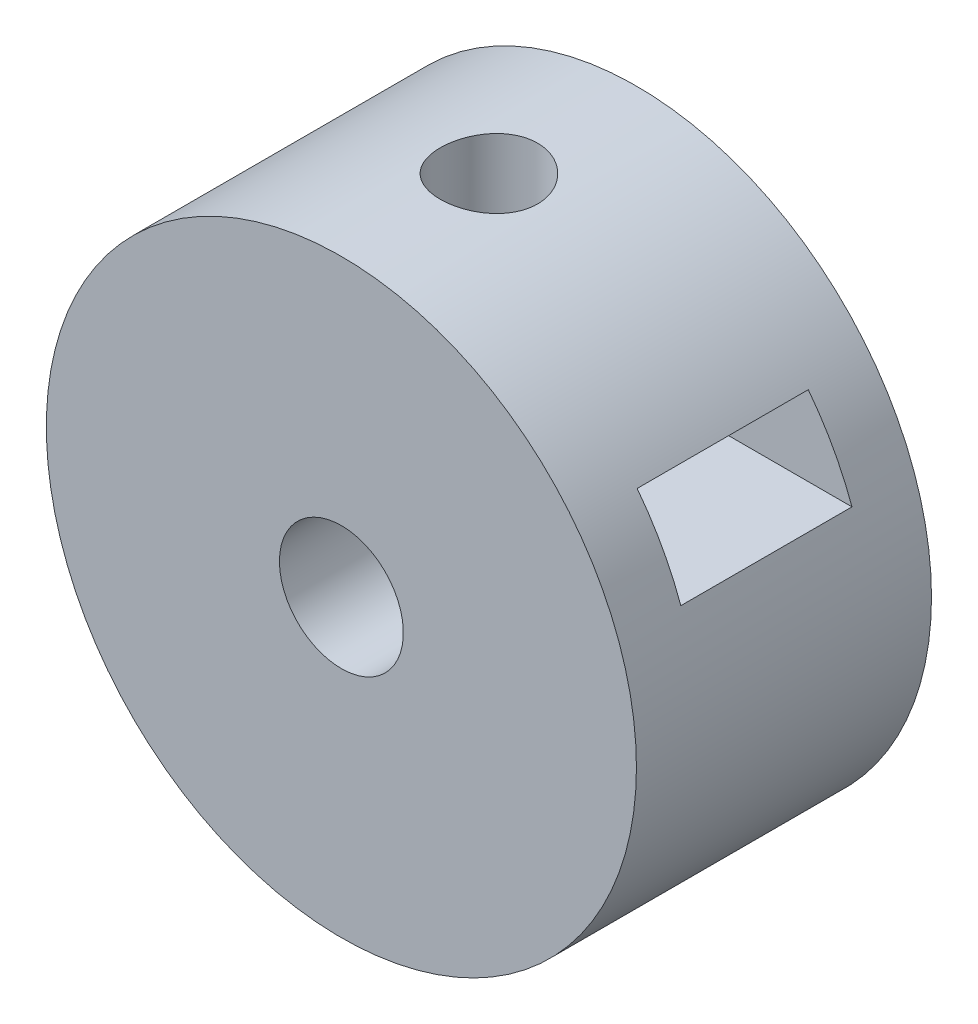
ISO-10303-21;
HEADER;
FILE_DESCRIPTION(('STEP AP214'),'2;1');
FILE_NAME('part.step','',(''),(''),'','','');
FILE_SCHEMA(('AUTOMOTIVE_DESIGN { 1 0 10303 214 1 1 1 1 }'));
ENDSEC;
DATA;
#1=APPLICATION_CONTEXT('core data for automotive mechanical design processes');
#2=APPLICATION_PROTOCOL_DEFINITION('international standard','automotive_design',2000,#1);
#3=PRODUCT_CONTEXT('',#1,'mechanical');
#4=PRODUCT('Part','Part','',(#3));
#5=PRODUCT_RELATED_PRODUCT_CATEGORY('part','',(#4));
#6=PRODUCT_DEFINITION_FORMATION('','',#4);
#7=PRODUCT_DEFINITION_CONTEXT('part definition',#1,'design');
#8=PRODUCT_DEFINITION('design','',#6,#7);
#9=PRODUCT_DEFINITION_SHAPE('','',#8);
#10=(LENGTH_UNIT() NAMED_UNIT(*) SI_UNIT(.MILLI.,.METRE.));
#11=(NAMED_UNIT(*) PLANE_ANGLE_UNIT() SI_UNIT($,.RADIAN.));
#12=(NAMED_UNIT(*) SI_UNIT($,.STERADIAN.) SOLID_ANGLE_UNIT());
#13=UNCERTAINTY_MEASURE_WITH_UNIT(LENGTH_MEASURE(1.E-05),#10,'distance_accuracy_value','');
#14=(GEOMETRIC_REPRESENTATION_CONTEXT(3) GLOBAL_UNCERTAINTY_ASSIGNED_CONTEXT((#13)) GLOBAL_UNIT_ASSIGNED_CONTEXT((#10,
#11,#12)) REPRESENTATION_CONTEXT('',''));
#15=CARTESIAN_POINT('',(0.,0.,0.));
#16=DIRECTION('',(0.,0.,1.));
#17=DIRECTION('',(1.,0.,0.));
#18=AXIS2_PLACEMENT_3D('',#15,#16,#17);
#19=CARTESIAN_POINT('',(0.,0.,5.));
#20=DIRECTION('',(0.,1.,0.));
#21=DIRECTION('',(0.,0.,1.));
#22=AXIS2_PLACEMENT_3D('',#19,#20,#21);
#23=CYLINDRICAL_SURFACE('',#22,1.65);
#24=CARTESIAN_POINT('',(0.,2.1,6.65));
#25=CARTESIAN_POINT('',(0.0796001917218926,2.0999938180354,6.64999361450812));
#26=CARTESIAN_POINT('',(0.159308770499119,2.09542768834569,6.64419275245601));
#27=CARTESIAN_POINT('',(0.316170572494338,2.07757117536402,6.6213729727077));
#28=CARTESIAN_POINT('',(0.393318112451337,2.06426259522657,6.60433065634434));
#29=CARTESIAN_POINT('',(0.542368135039011,2.03018382077281,6.56023747522717));
#30=CARTESIAN_POINT('',(0.614300091198769,2.00946025733616,6.53324912734498));
#31=CARTESIAN_POINT('',(0.752077362908829,1.96206497287833,6.47058386629792));
#32=CARTESIAN_POINT('',(0.817922465170863,1.93539304353326,6.43490664882713));
#33=CARTESIAN_POINT('',(0.964068401518123,1.86790135842462,6.34270711178072));
#34=CARTESIAN_POINT('',(1.04169930716527,1.82535110257821,6.28321874515638));
#35=CARTESIAN_POINT('',(1.18434758790923,1.73620969792247,6.15290838636037));
#36=CARTESIAN_POINT('',(1.24932779180486,1.68960720606361,6.08205407821168));
#37=CARTESIAN_POINT('',(1.36703855627689,1.59591069409266,5.92907238506917));
#38=CARTESIAN_POINT('',(1.41957731068858,1.54881937694977,5.84679609581782));
#39=CARTESIAN_POINT('',(1.51022360695896,1.46054381250586,5.67184371125375));
#40=CARTESIAN_POINT('',(1.54838104572859,1.41933945492904,5.57920504754939));
#41=CARTESIAN_POINT('',(1.59570742473321,1.36544561064423,5.42404025658079));
#42=CARTESIAN_POINT('',(1.61034132688087,1.34800506607107,5.36485700150996));
#43=CARTESIAN_POINT('',(1.63306902060523,1.32038195634849,5.24365707695354));
#44=CARTESIAN_POINT('',(1.64117835945663,1.31018214424956,5.18164751738944));
#45=CARTESIAN_POINT('',(1.65027043260621,1.29871896426366,5.05576546949217));
#46=CARTESIAN_POINT('',(1.65119930381098,1.29752314003772,4.99188250271423));
#47=CARTESIAN_POINT('',(1.6456926992374,1.30449590455939,4.86492832008789));
#48=CARTESIAN_POINT('',(1.63924962574396,1.31267415448361,4.80185800958314));
#49=CARTESIAN_POINT('',(1.61780178892174,1.33904613745083,4.66734621233217));
#50=CARTESIAN_POINT('',(1.6014694495673,1.35877227515616,4.59643047797041));
#51=CARTESIAN_POINT('',(1.56060761164531,1.40551219547294,4.45949918513617));
#52=CARTESIAN_POINT('',(1.53605491655817,1.43254655867279,4.39349814675986));
#53=CARTESIAN_POINT('',(1.46707205028577,1.50369994423796,4.23821719285571));
#54=CARTESIAN_POINT('',(1.41866360318922,1.55005033443668,4.1517381921342));
#55=CARTESIAN_POINT('',(1.30792828658772,1.64458528727684,3.98931138692952));
#56=CARTESIAN_POINT('',(1.24558322317743,1.69277217858693,3.913377560922));
#57=CARTESIAN_POINT('',(1.10598968758156,1.78718584128934,3.77143168100951));
#58=CARTESIAN_POINT('',(1.02847507323562,1.83335630332353,3.70564118311849));
#59=CARTESIAN_POINT('',(0.859952779591852,1.91815545967621,3.58809930131745));
#60=CARTESIAN_POINT('',(0.768983754166365,1.95680504781948,3.53630886305187));
#61=CARTESIAN_POINT('',(0.603780342156997,2.0126289826309,3.46261110957425));
#62=CARTESIAN_POINT('',(0.532466411604595,2.03277708869725,3.43639438391158));
#63=CARTESIAN_POINT('',(0.385324591087862,2.06571772060382,3.39380125336377));
#64=CARTESIAN_POINT('',(0.309500190789609,2.07851585335736,3.3774173471002));
#65=CARTESIAN_POINT('',(0.154999735900778,2.09571939451449,3.35543712386776));
#66=CARTESIAN_POINT('',(0.0763126631089624,2.10008786488932,3.34988828393385));
#67=CARTESIAN_POINT('',(-0.0810368611742931,2.09990947822907,3.35011509755749));
#68=CARTESIAN_POINT('',(-0.159699313603924,2.09536301708972,3.35589024823744));
#69=CARTESIAN_POINT('',(-0.309199419463994,2.07838350076403,3.37758859539958));
#70=CARTESIAN_POINT('',(-0.380206952578729,2.06650316581338,3.39280092243229));
#71=CARTESIAN_POINT('',(-0.518325557988668,2.03625679911049,3.43188187615466));
#72=CARTESIAN_POINT('',(-0.585435690987153,2.01788921138285,3.45575257960342));
#73=CARTESIAN_POINT('',(-0.719567651637166,1.97422723457336,3.51324168113832));
#74=CARTESIAN_POINT('',(-0.786188735403454,1.94850994336071,3.5474668113865));
#75=CARTESIAN_POINT('',(-0.912813832897116,1.8925042820974,3.62350680489809));
#76=CARTESIAN_POINT('',(-0.972814818947199,1.86221383540644,3.66532511793407));
#77=CARTESIAN_POINT('',(-1.09684245197889,1.79246481529262,3.76432121565521));
#78=CARTESIAN_POINT('',(-1.15938586791839,1.75236844571197,3.82290458959129));
#79=CARTESIAN_POINT('',(-1.27436601311465,1.67062027754788,3.94845191861328));
#80=CARTESIAN_POINT('',(-1.32678853788087,1.62896638942296,4.01542743777836));
#81=CARTESIAN_POINT('',(-1.41986675636619,1.54843631652797,4.15539526452938));
#82=CARTESIAN_POINT('',(-1.46080385505605,1.50951538790248,4.22817422184057));
#83=CARTESIAN_POINT('',(-1.53195600389831,1.43724358947683,4.38136235746067));
#84=CARTESIAN_POINT('',(-1.56219356778283,1.40388110299937,4.46175505745555));
#85=CARTESIAN_POINT('',(-1.6027454746411,1.35714834773738,4.60340485913962));
#86=CARTESIAN_POINT('',(-1.61633523761651,1.34079083862987,4.66271530905632));
#87=CARTESIAN_POINT('',(-1.63694597357536,1.31555276369334,4.78396613270172));
#88=CARTESIAN_POINT('',(-1.64398165953626,1.30665545527864,4.84590028795323));
#89=CARTESIAN_POINT('',(-1.65094807892772,1.29784797344929,4.97123889460129));
#90=CARTESIAN_POINT('',(-1.6508336173396,1.29799496763775,5.0346501654927));
#91=CARTESIAN_POINT('',(-1.64339764675994,1.30739182936648,5.1603893372944));
#92=CARTESIAN_POINT('',(-1.63606718526497,1.31665300437753,5.22271579458027));
#93=CARTESIAN_POINT('',(-1.61250400832135,1.34545038175293,5.3577735263882));
#94=CARTESIAN_POINT('',(-1.59468547500907,1.36677930482589,5.42983004432642));
#95=CARTESIAN_POINT('',(-1.55060852916343,1.41658657292558,5.5687318093002));
#96=CARTESIAN_POINT('',(-1.52432612117107,1.44508519349438,5.63556156058102));
#97=CARTESIAN_POINT('',(-1.45126639380762,1.51906368171455,5.7916016941077));
#98=CARTESIAN_POINT('',(-1.40054067680743,1.56655928090644,5.8780008846119));
#99=CARTESIAN_POINT('',(-1.28487186823615,1.6627687513611,6.03995622008662));
#100=CARTESIAN_POINT('',(-1.21991247055743,1.71148396264931,6.1154997631153));
#101=CARTESIAN_POINT('',(-1.07507073475416,1.806051241021,6.25579819648507));
#102=CARTESIAN_POINT('',(-0.99498707620665,1.85185200990308,6.32038216477662));
#103=CARTESIAN_POINT('',(-0.821210776278299,1.93515547328398,6.43487203880746));
#104=CARTESIAN_POINT('',(-0.727555859078121,1.97268046573947,6.48481750862035));
#105=CARTESIAN_POINT('',(-0.559761451594887,2.02529918212826,6.55391848950023));
#106=CARTESIAN_POINT('',(-0.488606159769221,2.04373969025009,6.57781893609655));
#107=CARTESIAN_POINT('',(-0.342344605279582,2.07323990795691,6.615849955775));
#108=CARTESIAN_POINT('',(-0.267248873170231,2.08431830666141,6.63000527072368));
#109=CARTESIAN_POINT('',(-0.159594987942083,2.09416999414735,6.64257467488049));
#110=CARTESIAN_POINT('',(-0.127787691220449,2.09635137850741,6.64535421655978));
#111=CARTESIAN_POINT('',(-0.063992797513904,2.09926779444843,6.6490683799553));
#112=CARTESIAN_POINT('',(-0.0320051598682212,2.10000248560664,6.65000256743965));
#113=CARTESIAN_POINT('',(0.,2.1,6.65));
#114=B_SPLINE_CURVE_WITH_KNOTS('',3,(#24,#25,#26,#27,#28,#29,#30,#31,#32,#33,#34,#35,#36,#37,
#38,#39,#40,#41,#42,#43,#44,#45,#46,#47,#48,#49,#50,#51,#52,#53,#54,#55,#56,#57,#58,#59,#60,#61,
#62,#63,#64,#65,#66,#67,#68,#69,#70,#71,#72,#73,#74,#75,#76,#77,#78,#79,#80,#81,#82,#83,#84,#85,
#86,#87,#88,#89,#90,#91,#92,#93,#94,#95,#96,#97,#98,#99,#100,#101,#102,#103,#104,#105,#106,#107,
#108,#109,#110,#111,#112,#113),.UNSPECIFIED.,.T.,.F.,(4,2,2,2,2,2,2,2,2,2,2,2,2,2,2,2,2,2,2,2,2,
2,2,2,2,2,2,2,2,2,2,2,2,2,2,2,2,2,2,2,2,2,2,2,4),(0.,0.238661472958411,0.477821285085834,
0.715502781694245,0.953192603699511,1.27148632735928,1.5907016186489,1.91455736970206,
2.2372789056034,2.42686912721923,2.61600622818342,2.80656074601866,2.99731183126047,
3.22225238489295,3.44783311078609,3.77436809280817,4.10133187377641,4.43465133130391,
4.76703113897674,5.00189559537822,5.23658064706573,5.47229175309842,5.70799239187121,
5.92779265636468,6.14764567605816,6.38434382448235,6.62114978109132,6.90396996247715,
7.18718423654335,7.46269090616848,7.73761436414506,7.92595962488161,8.11388105094998,
8.30299041984844,8.49233470265541,8.72274064709717,8.95380563966567,9.28474027874506,
9.61605603742465,9.95214020627244,10.2873074682569,10.5182801291943,10.7486641904491,
10.8446011683606,10.9405607185977),.UNSPECIFIED.);
#115=CARTESIAN_POINT('',(0.,2.1,6.65));
#116=VERTEX_POINT('',#115);
#117=EDGE_CURVE('E143',#116,#116,#114,.T.);
#118=ORIENTED_EDGE('',*,*,#117,.F.);
#119=EDGE_LOOP('',(#118));
#120=FACE_BOUND('',#119,.T.);
#121=CARTESIAN_POINT('',(0.,3.4,5.));
#122=DIRECTION('',(0.,1.,0.));
#123=DIRECTION('',(0.,0.,1.));
#124=AXIS2_PLACEMENT_3D('',#121,#122,#123);
#125=CIRCLE('',#124,1.65);
#126=CARTESIAN_POINT('',(0.,3.4,6.65));
#127=VERTEX_POINT('',#126);
#128=EDGE_CURVE('E134',#127,#127,#125,.T.);
#129=ORIENTED_EDGE('',*,*,#128,.T.);
#130=EDGE_LOOP('',(#129));
#131=FACE_BOUND('',#130,.T.);
#132=ADVANCED_FACE('F44',(#120,#131),#23,.F.);
#133=CARTESIAN_POINT('',(0.,0.,10.));
#134=DIRECTION('',(0.,0.,-1.));
#135=DIRECTION('',(-1.,0.,0.));
#136=AXIS2_PLACEMENT_3D('',#133,#134,#135);
#137=CYLINDRICAL_SURFACE('',#136,10.);
#138=CARTESIAN_POINT('',(0.,10.,6.65));
#139=CARTESIAN_POINT('',(-0.0920114531057516,9.99999843258099,6.64999629901469));
#140=CARTESIAN_POINT('',(-0.184073454347173,9.99871684765511,6.64227754131458));
#141=CARTESIAN_POINT('',(-0.36561632253533,9.99372775496381,6.61161876486207));
#142=CARTESIAN_POINT('',(-0.45509472135177,9.99001800272159,6.5886646630412));
#143=CARTESIAN_POINT('',(-0.628817487751616,9.98058875631552,6.52824636106409));
#144=CARTESIAN_POINT('',(-0.713066038744486,9.974870893487,6.4907939364397));
#145=CARTESIAN_POINT('',(-0.874072236504043,9.96205444853338,6.40247274585138));
#146=CARTESIAN_POINT('',(-0.95083075765333,9.95495602786423,6.35160554849499));
#147=CARTESIAN_POINT('',(-1.09540879372213,9.9400912001718,6.23739122286708));
#148=CARTESIAN_POINT('',(-1.16314787882339,9.93231968689365,6.17394293638175));
#149=CARTESIAN_POINT('',(-1.28706950777735,9.9170237472334,6.03658522640678));
#150=CARTESIAN_POINT('',(-1.34325132909589,9.90949933632427,5.96267514935682));
#151=CARTESIAN_POINT('',(-1.44278500045253,9.89550007731641,5.80594065632332));
#152=CARTESIAN_POINT('',(-1.48605749570899,9.88903182722124,5.72306520565612));
#153=CARTESIAN_POINT('',(-1.55803674048924,9.87794796970923,5.55109737476351));
#154=CARTESIAN_POINT('',(-1.58674445381556,9.87333223970889,5.46200540635072));
#155=CARTESIAN_POINT('',(-1.6285261950301,9.86652679242373,5.28098541799901));
#156=CARTESIAN_POINT('',(-1.64173895927951,9.86431555933323,5.18909024432124));
#157=CARTESIAN_POINT('',(-1.65258585530687,9.86250435770823,5.00436263407657));
#158=CARTESIAN_POINT('',(-1.6502210677036,9.86290420804218,4.91153026296937));
#159=CARTESIAN_POINT('',(-1.63009303176278,9.86625034802632,4.72855272294329));
#160=CARTESIAN_POINT('',(-1.61248549472488,9.86917088684506,4.63838988597263));
#161=CARTESIAN_POINT('',(-1.5626160736781,9.87718903199043,4.4623159294666));
#162=CARTESIAN_POINT('',(-1.53035369619838,9.88228671162733,4.37640495321172));
#163=CARTESIAN_POINT('',(-1.45193210975571,9.89411264039674,4.21080647007558));
#164=CARTESIAN_POINT('',(-1.4057081060585,9.90084846298694,4.13115021075931));
#165=CARTESIAN_POINT('',(-1.30072141548377,9.9151864393107,3.98066567609225));
#166=CARTESIAN_POINT('',(-1.24195773629987,9.92278866158316,3.90983810008771));
#167=CARTESIAN_POINT('',(-1.11271072676603,9.93811607123993,3.77812002111733));
#168=CARTESIAN_POINT('',(-1.04209376928223,9.94584163094155,3.71736060537004));
#169=CARTESIAN_POINT('',(-0.891597059898568,9.96045987838133,3.60853397839373));
#170=CARTESIAN_POINT('',(-0.811717250503359,9.9673525609492,3.56046684595291));
#171=CARTESIAN_POINT('',(-0.644840083170755,9.97953794169528,3.47837784946568));
#172=CARTESIAN_POINT('',(-0.557837003156561,9.98482933722619,3.44436741236198));
#173=CARTESIAN_POINT('',(-0.379246930002472,9.99320544362233,3.39147808722466));
#174=CARTESIAN_POINT('',(-0.287660313260822,9.99629033536768,3.37259795885521));
#175=CARTESIAN_POINT('',(-0.103632983819162,9.99988156603306,3.35068253883883));
#176=CARTESIAN_POINT('',(-0.0112142564118358,10.0004171933872,3.34746726387846));
#177=CARTESIAN_POINT('',(0.172841505554681,9.99892971175882,3.35649319868026));
#178=CARTESIAN_POINT('',(0.264478569441164,9.99690669920295,3.36873382596047));
#179=CARTESIAN_POINT('',(0.443814955541769,9.99054737820398,3.4081744027771));
#180=CARTESIAN_POINT('',(0.531534371938301,9.98622483070291,3.43528539430835));
#181=CARTESIAN_POINT('',(0.701182959294593,9.97574921956607,3.50360239255507));
#182=CARTESIAN_POINT('',(0.78311181018899,9.96959605484327,3.54480917766168));
#183=CARTESIAN_POINT('',(0.939636398877252,9.95606928426946,3.64056131949898));
#184=CARTESIAN_POINT('',(1.01416235726447,9.94868555427359,3.6952192859171));
#185=CARTESIAN_POINT('',(1.15304841333209,9.93354765732487,3.81616714906879));
#186=CARTESIAN_POINT('',(1.21740778758216,9.92579346406183,3.88245787285429));
#187=CARTESIAN_POINT('',(1.33479962911472,9.91069407401676,4.0255961063283));
#188=CARTESIAN_POINT('',(1.38771058951944,9.90335382329475,4.10254387109881));
#189=CARTESIAN_POINT('',(1.47985547415617,9.89000528724129,4.26434104706746));
#190=CARTESIAN_POINT('',(1.51908982562647,9.88399696030451,4.34919021133191));
#191=CARTESIAN_POINT('',(1.58258535747086,9.87402953570153,4.52403953240315));
#192=CARTESIAN_POINT('',(1.60690737863649,9.87006212213643,4.61401709979667));
#193=CARTESIAN_POINT('',(1.64007952798876,9.86460473721113,4.79685131178056));
#194=CARTESIAN_POINT('',(1.64893097191819,9.86311455516768,4.88970771084816));
#195=CARTESIAN_POINT('',(1.65087457438796,9.86278931217107,5.07445064130181));
#196=CARTESIAN_POINT('',(1.64415796786954,9.86392203182987,5.16633516019211));
#197=CARTESIAN_POINT('',(1.61556925478547,9.86864441177183,5.34764775186387));
#198=CARTESIAN_POINT('',(1.59369719454886,9.87223406454433,5.4370758321536));
#199=CARTESIAN_POINT('',(1.53549112071357,9.88145370519205,5.61086524243541));
#200=CARTESIAN_POINT('',(1.49917324977366,9.88708141498759,5.69523210745097));
#201=CARTESIAN_POINT('',(1.41312606218935,9.89974533231771,5.85670626686032));
#202=CARTESIAN_POINT('',(1.36339610211421,9.90678160742252,5.93381321272773));
#203=CARTESIAN_POINT('',(1.25125259966706,9.92157214136343,6.07954549763769));
#204=CARTESIAN_POINT('',(1.18869826623127,9.92933379899765,6.14806175981957));
#205=CARTESIAN_POINT('',(1.05297867490409,9.94464125601211,6.27369059987676));
#206=CARTESIAN_POINT('',(0.979810970092673,9.95218700513286,6.33080054078024));
#207=CARTESIAN_POINT('',(0.824354696103048,9.96627143049842,6.43234742257348));
#208=CARTESIAN_POINT('',(0.742007852048189,9.97280295936929,6.47669614797803));
#209=CARTESIAN_POINT('',(0.570959586923796,9.98405342047581,6.55086335280631));
#210=CARTESIAN_POINT('',(0.482264623543764,9.98877416450827,6.58069636412524));
#211=CARTESIAN_POINT('',(0.327682758240929,9.99483601455804,6.61847934152685));
#212=CARTESIAN_POINT('',(0.2627330667111,9.99676220083327,6.6302807488145));
#213=CARTESIAN_POINT('',(0.131864227625941,9.99934474465587,6.64604233893311));
#214=CARTESIAN_POINT('',(0.0659450962546689,10.0000011233775,6.65000265251579));
#215=CARTESIAN_POINT('',(0.,10.,6.65));
#216=B_SPLINE_CURVE_WITH_KNOTS('',3,(#138,#139,#140,#141,#142,#143,#144,#145,#146,#147,#148,
#149,#150,#151,#152,#153,#154,#155,#156,#157,#158,#159,#160,#161,#162,#163,#164,#165,#166,#167,
#168,#169,#170,#171,#172,#173,#174,#175,#176,#177,#178,#179,#180,#181,#182,#183,#184,#185,#186,
#187,#188,#189,#190,#191,#192,#193,#194,#195,#196,#197,#198,#199,#200,#201,#202,#203,#204,#205,
#206,#207,#208,#209,#210,#211,#212,#213,#214,#215),.UNSPECIFIED.,.T.,.F.,(4,2,2,2,2,2,2,2,2,2,2,
2,2,2,2,2,2,2,2,2,2,2,2,2,2,2,2,2,2,2,2,2,2,2,2,2,2,2,4),(0.,0.275793319008919,
0.551841928312974,0.827666799870601,1.10345943314171,1.38156673144316,1.65969141110742,
1.93949209608634,2.21927426326045,2.49653175525207,2.7737700140227,3.04820914252877,
3.32265751287873,3.59839967320043,3.87416366201708,4.15327572401922,4.43238951858749,
4.71172976565334,4.99104711092803,5.26714751096619,5.54323750600192,5.81769359979006,
6.09216485190805,6.36901711215388,6.6458890636926,6.92556925596461,7.2052407106323,
7.48376340648036,7.76226241335699,8.03735855216248,8.31245385002405,8.58724259883662,
8.8620445326932,9.14004258759621,9.41810483731135,9.69804546871321,9.97770526783285,
10.1753710978728,10.3730336317699),.UNSPECIFIED.);
#217=CARTESIAN_POINT('',(0.,10.,6.65));
#218=VERTEX_POINT('',#217);
#219=EDGE_CURVE('E152',#218,#218,#216,.T.);
#220=ORIENTED_EDGE('',*,*,#219,.T.);
#221=EDGE_LOOP('',(#220));
#222=FACE_BOUND('',#221,.T.);
#223=CARTESIAN_POINT('',(0.,0.,0.));
#224=DIRECTION('',(0.,0.,1.));
#225=DIRECTION('',(1.,0.,0.));
#226=AXIS2_PLACEMENT_3D('',#223,#224,#225);
#227=CIRCLE('',#226,10.);
#228=CARTESIAN_POINT('',(10.,0.,0.));
#229=VERTEX_POINT('',#228);
#230=EDGE_CURVE('E208',#229,#229,#227,.T.);
#231=ORIENTED_EDGE('',*,*,#230,.T.);
#232=EDGE_LOOP('',(#231));
#233=FACE_BOUND('',#232,.T.);
#234=CARTESIAN_POINT('',(0.,0.,10.));
#235=DIRECTION('',(0.,0.,1.));
#236=DIRECTION('',(1.,0.,0.));
#237=AXIS2_PLACEMENT_3D('',#234,#235,#236);
#238=CIRCLE('',#237,10.);
#239=CARTESIAN_POINT('',(10.,0.,10.));
#240=VERTEX_POINT('',#239);
#241=EDGE_CURVE('E214',#240,#240,#238,.T.);
#242=ORIENTED_EDGE('',*,*,#241,.F.);
#243=EDGE_LOOP('',(#242));
#244=FACE_BOUND('',#243,.T.);
#245=DIRECTION('',(0.,0.,-1.));
#246=VECTOR('',#245,1.);
#247=CARTESIAN_POINT('',(7.92401413426301,6.1,10.));
#248=LINE('',#247,#246);
#249=CARTESIAN_POINT('',(7.92401413426301,6.1,2.1));
#250=VERTEX_POINT('',#249);
#251=CARTESIAN_POINT('',(7.92401413426301,6.1,7.9));
#252=VERTEX_POINT('',#251);
#253=EDGE_CURVE('E12',#250,#252,#248,.F.);
#254=ORIENTED_EDGE('',*,*,#253,.F.);
#255=CARTESIAN_POINT('',(0.,0.,2.1));
#256=DIRECTION('',(0.,0.,1.));
#257=DIRECTION('',(1.,0.,0.));
#258=AXIS2_PLACEMENT_3D('',#255,#256,#257);
#259=CIRCLE('',#258,10.);
#260=CARTESIAN_POINT('',(9.404254356407,3.4,2.1));
#261=VERTEX_POINT('',#260);
#262=EDGE_CURVE('E54',#261,#250,#259,.T.);
#263=ORIENTED_EDGE('',*,*,#262,.F.);
#264=DIRECTION('',(0.,0.,-1.));
#265=VECTOR('',#264,1.);
#266=CARTESIAN_POINT('',(9.404254356407,3.4,10.));
#267=LINE('',#266,#265);
#268=CARTESIAN_POINT('',(9.404254356407,3.4,7.9));
#269=VERTEX_POINT('',#268);
#270=EDGE_CURVE('E99',#269,#261,#267,.T.);
#271=ORIENTED_EDGE('',*,*,#270,.F.);
#272=CARTESIAN_POINT('',(0.,0.,7.9));
#273=DIRECTION('',(0.,0.,-1.));
#274=DIRECTION('',(-1.,0.,0.));
#275=AXIS2_PLACEMENT_3D('',#272,#273,#274);
#276=CIRCLE('',#275,10.);
#277=EDGE_CURVE('E218',#252,#269,#276,.T.);
#278=ORIENTED_EDGE('',*,*,#277,.F.);
#279=EDGE_LOOP('',(#254,#263,#271,#278));
#280=FACE_BOUND('',#279,.T.);
#281=ADVANCED_FACE('F46',(#222,#233,#244,#280),#137,.T.);
#282=CARTESIAN_POINT('',(0.,0.,10.));
#283=DIRECTION('',(0.,0.,1.));
#284=DIRECTION('',(1.,0.,0.));
#285=AXIS2_PLACEMENT_3D('',#282,#283,#284);
#286=PLANE('',#285);
#287=CARTESIAN_POINT('',(0.,0.,10.));
#288=DIRECTION('',(0.,0.,-1.));
#289=DIRECTION('',(-1.,0.,0.));
#290=AXIS2_PLACEMENT_3D('',#287,#288,#289);
#291=CIRCLE('',#290,2.1);
#292=CARTESIAN_POINT('',(-2.1,0.,10.));
#293=VERTEX_POINT('',#292);
#294=EDGE_CURVE('E199',#293,#293,#291,.T.);
#295=ORIENTED_EDGE('',*,*,#294,.T.);
#296=EDGE_LOOP('',(#295));
#297=FACE_BOUND('',#296,.T.);
#298=ORIENTED_EDGE('',*,*,#241,.T.);
#299=EDGE_LOOP('',(#298));
#300=FACE_BOUND('',#299,.T.);
#301=ADVANCED_FACE('F187',(#297,#300),#286,.T.);
#302=CARTESIAN_POINT('',(0.,0.,0.));
#303=DIRECTION('',(0.,0.,1.));
#304=DIRECTION('',(1.,0.,0.));
#305=AXIS2_PLACEMENT_3D('',#302,#303,#304);
#306=PLANE('',#305);
#307=CARTESIAN_POINT('',(0.,0.,0.));
#308=DIRECTION('',(0.,0.,-1.));
#309=DIRECTION('',(-1.,0.,0.));
#310=AXIS2_PLACEMENT_3D('',#307,#308,#309);
#311=CIRCLE('',#310,2.1);
#312=CARTESIAN_POINT('',(-2.1,0.,0.));
#313=VERTEX_POINT('',#312);
#314=EDGE_CURVE('E202',#313,#313,#311,.T.);
#315=ORIENTED_EDGE('',*,*,#314,.F.);
#316=EDGE_LOOP('',(#315));
#317=FACE_BOUND('',#316,.T.);
#318=ORIENTED_EDGE('',*,*,#230,.F.);
#319=EDGE_LOOP('',(#318));
#320=FACE_BOUND('',#319,.T.);
#321=ADVANCED_FACE('F195',(#317,#320),#306,.F.);
#322=CARTESIAN_POINT('',(0.,0.,10.));
#323=DIRECTION('',(0.,0.,-1.));
#324=DIRECTION('',(-1.,0.,0.));
#325=AXIS2_PLACEMENT_3D('',#322,#323,#324);
#326=CYLINDRICAL_SURFACE('',#325,2.1);
#327=ORIENTED_EDGE('',*,*,#117,.T.);
#328=EDGE_LOOP('',(#327));
#329=FACE_BOUND('',#328,.T.);
#330=ORIENTED_EDGE('',*,*,#294,.F.);
#331=EDGE_LOOP('',(#330));
#332=FACE_BOUND('',#331,.T.);
#333=ORIENTED_EDGE('',*,*,#314,.T.);
#334=EDGE_LOOP('',(#333));
#335=FACE_BOUND('',#334,.T.);
#336=ADVANCED_FACE('F157',(#329,#332,#335),#326,.F.);
#337=CARTESIAN_POINT('',(10.,6.1,7.9));
#338=DIRECTION('',(0.,-1.,0.));
#339=DIRECTION('',(0.,0.,-1.));
#340=AXIS2_PLACEMENT_3D('',#337,#338,#339);
#341=PLANE('',#340);
#342=DIRECTION('',(-1.,0.,0.));
#343=VECTOR('',#342,1.);
#344=CARTESIAN_POINT('',(10.,6.1,7.9));
#345=LINE('',#344,#343);
#346=CARTESIAN_POINT('',(-1.67431578064992,6.1,7.9));
#347=VERTEX_POINT('',#346);
#348=EDGE_CURVE('E61',#252,#347,#345,.T.);
#349=ORIENTED_EDGE('',*,*,#348,.T.);
#350=DIRECTION('',(0.5,0.,0.866025403784438));
#351=VECTOR('',#350,1.);
#352=CARTESIAN_POINT('',(-3.34863156129983,6.1,5.));
#353=LINE('',#352,#351);
#354=CARTESIAN_POINT('',(-3.34863156129983,6.1,5.));
#355=VERTEX_POINT('',#354);
#356=EDGE_CURVE('E117',#355,#347,#353,.T.);
#357=ORIENTED_EDGE('',*,*,#356,.F.);
#358=DIRECTION('',(-0.5,0.,0.866025403784439));
#359=VECTOR('',#358,1.);
#360=CARTESIAN_POINT('',(-1.67431578064992,6.1,2.1));
#361=LINE('',#360,#359);
#362=CARTESIAN_POINT('',(-1.67431578064992,6.1,2.1));
#363=VERTEX_POINT('',#362);
#364=EDGE_CURVE('E126',#363,#355,#361,.T.);
#365=ORIENTED_EDGE('',*,*,#364,.F.);
#366=DIRECTION('',(-1.,0.,0.));
#367=VECTOR('',#366,1.);
#368=CARTESIAN_POINT('',(10.,6.1,2.1));
#369=LINE('',#368,#367);
#370=EDGE_CURVE('E106',#250,#363,#369,.T.);
#371=ORIENTED_EDGE('',*,*,#370,.F.);
#372=ORIENTED_EDGE('',*,*,#253,.T.);
#373=EDGE_LOOP('',(#349,#357,#365,#371,#372));
#374=FACE_BOUND('',#373,.T.);
#375=CARTESIAN_POINT('',(0.,6.1,5.));
#376=DIRECTION('',(0.,-1.,0.));
#377=DIRECTION('',(0.,0.,-1.));
#378=AXIS2_PLACEMENT_3D('',#375,#376,#377);
#379=CIRCLE('',#378,1.65);
#380=CARTESIAN_POINT('',(0.,6.1,3.35));
#381=VERTEX_POINT('',#380);
#382=EDGE_CURVE('E139',#381,#381,#379,.T.);
#383=ORIENTED_EDGE('',*,*,#382,.F.);
#384=EDGE_LOOP('',(#383));
#385=FACE_BOUND('',#384,.T.);
#386=ADVANCED_FACE('F170',(#374,#385),#341,.T.);
#387=CARTESIAN_POINT('',(10.,6.1,2.1));
#388=DIRECTION('',(0.,0.,1.));
#389=DIRECTION('',(1.,0.,0.));
#390=AXIS2_PLACEMENT_3D('',#387,#388,#389);
#391=PLANE('',#390);
#392=ORIENTED_EDGE('',*,*,#370,.T.);
#393=DIRECTION('',(0.,1.,0.));
#394=VECTOR('',#393,1.);
#395=CARTESIAN_POINT('',(-1.67431578064992,3.4,2.1));
#396=LINE('',#395,#394);
#397=CARTESIAN_POINT('',(-1.67431578064992,3.4,2.1));
#398=VERTEX_POINT('',#397);
#399=EDGE_CURVE('E104',#398,#363,#396,.T.);
#400=ORIENTED_EDGE('',*,*,#399,.F.);
#401=DIRECTION('',(-1.,0.,0.));
#402=VECTOR('',#401,1.);
#403=CARTESIAN_POINT('',(10.,3.4,2.1));
#404=LINE('',#403,#402);
#405=EDGE_CURVE('E91',#261,#398,#404,.T.);
#406=ORIENTED_EDGE('',*,*,#405,.F.);
#407=ORIENTED_EDGE('',*,*,#262,.T.);
#408=EDGE_LOOP('',(#392,#400,#406,#407));
#409=FACE_BOUND('',#408,.T.);
#410=ADVANCED_FACE('F105',(#409),#391,.T.);
#411=CARTESIAN_POINT('',(10.,3.4,7.9));
#412=DIRECTION('',(0.,1.,0.));
#413=DIRECTION('',(0.,0.,1.));
#414=AXIS2_PLACEMENT_3D('',#411,#412,#413);
#415=PLANE('',#414);
#416=ORIENTED_EDGE('',*,*,#128,.F.);
#417=EDGE_LOOP('',(#416));
#418=FACE_BOUND('',#417,.T.);
#419=ORIENTED_EDGE('',*,*,#405,.T.);
#420=DIRECTION('',(-0.5,0.,0.866025403784439));
#421=VECTOR('',#420,1.);
#422=CARTESIAN_POINT('',(-1.67431578064992,3.4,2.1));
#423=LINE('',#422,#421);
#424=CARTESIAN_POINT('',(-3.34863156129983,3.4,5.));
#425=VERTEX_POINT('',#424);
#426=EDGE_CURVE('E96',#398,#425,#423,.T.);
#427=ORIENTED_EDGE('',*,*,#426,.T.);
#428=DIRECTION('',(0.5,0.,0.866025403784438));
#429=VECTOR('',#428,1.);
#430=CARTESIAN_POINT('',(-3.34863156129983,3.4,5.));
#431=LINE('',#430,#429);
#432=CARTESIAN_POINT('',(-1.67431578064992,3.4,7.9));
#433=VERTEX_POINT('',#432);
#434=EDGE_CURVE('E112',#425,#433,#431,.T.);
#435=ORIENTED_EDGE('',*,*,#434,.T.);
#436=DIRECTION('',(-1.,0.,0.));
#437=VECTOR('',#436,1.);
#438=CARTESIAN_POINT('',(10.,3.4,7.9));
#439=LINE('',#438,#437);
#440=EDGE_CURVE('E101',#269,#433,#439,.T.);
#441=ORIENTED_EDGE('',*,*,#440,.F.);
#442=ORIENTED_EDGE('',*,*,#270,.T.);
#443=EDGE_LOOP('',(#419,#427,#435,#441,#442));
#444=FACE_BOUND('',#443,.T.);
#445=ADVANCED_FACE('F93',(#418,#444),#415,.T.);
#446=CARTESIAN_POINT('',(10.,6.1,7.9));
#447=DIRECTION('',(0.,0.,-1.));
#448=DIRECTION('',(-1.,0.,0.));
#449=AXIS2_PLACEMENT_3D('',#446,#447,#448);
#450=PLANE('',#449);
#451=ORIENTED_EDGE('',*,*,#440,.T.);
#452=DIRECTION('',(0.,1.,0.));
#453=VECTOR('',#452,1.);
#454=CARTESIAN_POINT('',(-1.67431578064992,3.4,7.9));
#455=LINE('',#454,#453);
#456=EDGE_CURVE('E131',#433,#347,#455,.T.);
#457=ORIENTED_EDGE('',*,*,#456,.T.);
#458=ORIENTED_EDGE('',*,*,#348,.F.);
#459=ORIENTED_EDGE('',*,*,#277,.T.);
#460=EDGE_LOOP('',(#451,#457,#458,#459));
#461=FACE_BOUND('',#460,.T.);
#462=ADVANCED_FACE('F167',(#461),#450,.T.);
#463=ORIENTED_EDGE('',*,*,#382,.T.);
#464=EDGE_LOOP('',(#463));
#465=FACE_BOUND('',#464,.T.);
#466=ORIENTED_EDGE('',*,*,#219,.F.);
#467=EDGE_LOOP('',(#466));
#468=FACE_BOUND('',#467,.T.);
#469=ADVANCED_FACE('F161',(#465,#468),#23,.F.);
#470=CARTESIAN_POINT('',(-3.34863156129983,3.4,5.));
#471=DIRECTION('',(-0.866025403784439,0.,0.5));
#472=DIRECTION('',(0.5,0.,0.866025403784439));
#473=AXIS2_PLACEMENT_3D('',#470,#471,#472);
#474=PLANE('',#473);
#475=ORIENTED_EDGE('',*,*,#356,.T.);
#476=ORIENTED_EDGE('',*,*,#456,.F.);
#477=ORIENTED_EDGE('',*,*,#434,.F.);
#478=DIRECTION('',(0.,1.,0.));
#479=VECTOR('',#478,1.);
#480=CARTESIAN_POINT('',(-3.34863156129983,3.4,5.));
#481=LINE('',#480,#479);
#482=EDGE_CURVE('E111',#425,#355,#481,.T.);
#483=ORIENTED_EDGE('',*,*,#482,.T.);
#484=EDGE_LOOP('',(#475,#476,#477,#483));
#485=FACE_BOUND('',#484,.T.);
#486=ADVANCED_FACE('F166',(#485),#474,.F.);
#487=CARTESIAN_POINT('',(-1.67431578064992,3.4,2.1));
#488=DIRECTION('',(-0.866025403784439,0.,-0.5));
#489=DIRECTION('',(-0.5,0.,0.866025403784439));
#490=AXIS2_PLACEMENT_3D('',#487,#488,#489);
#491=PLANE('',#490);
#492=ORIENTED_EDGE('',*,*,#364,.T.);
#493=ORIENTED_EDGE('',*,*,#482,.F.);
#494=ORIENTED_EDGE('',*,*,#426,.F.);
#495=ORIENTED_EDGE('',*,*,#399,.T.);
#496=EDGE_LOOP('',(#492,#493,#494,#495));
#497=FACE_BOUND('',#496,.T.);
#498=ADVANCED_FACE('F114',(#497),#491,.F.);
#499=CLOSED_SHELL('',(#132,#281,#301,#321,#336,#386,#410,#445,#462,#469,#486,#498));
#500=MANIFOLD_SOLID_BREP('B2',#499);
#501=ADVANCED_BREP_SHAPE_REPRESENTATION('',(#18,#500),#14);
#502=SHAPE_DEFINITION_REPRESENTATION(#9,#501);
ENDSEC;
END-ISO-10303-21;
